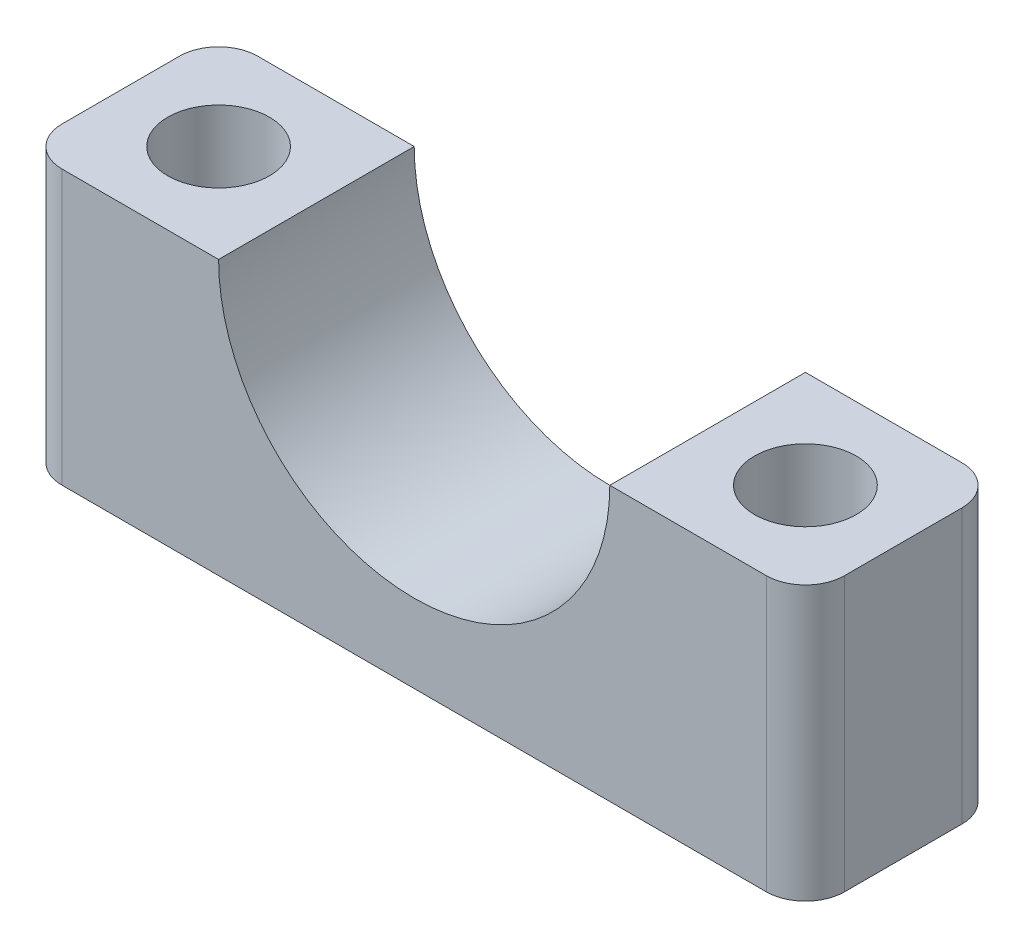
ISO-10303-21;
HEADER;
FILE_DESCRIPTION(('STEP AP214'),'2;1');
FILE_NAME('part.step','',(''),(''),'','','');
FILE_SCHEMA(('AUTOMOTIVE_DESIGN { 1 0 10303 214 1 1 1 1 }'));
ENDSEC;
DATA;
#1=APPLICATION_CONTEXT('core data for automotive mechanical design processes');
#2=APPLICATION_PROTOCOL_DEFINITION('international standard','automotive_design',2000,#1);
#3=PRODUCT_CONTEXT('',#1,'mechanical');
#4=PRODUCT('Part','Part','',(#3));
#5=PRODUCT_RELATED_PRODUCT_CATEGORY('part','',(#4));
#6=PRODUCT_DEFINITION_FORMATION('','',#4);
#7=PRODUCT_DEFINITION_CONTEXT('part definition',#1,'design');
#8=PRODUCT_DEFINITION('design','',#6,#7);
#9=PRODUCT_DEFINITION_SHAPE('','',#8);
#10=(LENGTH_UNIT() NAMED_UNIT(*) SI_UNIT(.MILLI.,.METRE.));
#11=(NAMED_UNIT(*) PLANE_ANGLE_UNIT() SI_UNIT($,.RADIAN.));
#12=(NAMED_UNIT(*) SI_UNIT($,.STERADIAN.) SOLID_ANGLE_UNIT());
#13=UNCERTAINTY_MEASURE_WITH_UNIT(LENGTH_MEASURE(1.E-05),#10,'distance_accuracy_value','');
#14=(GEOMETRIC_REPRESENTATION_CONTEXT(3) GLOBAL_UNCERTAINTY_ASSIGNED_CONTEXT((#13)) GLOBAL_UNIT_ASSIGNED_CONTEXT((#10,
#11,#12)) REPRESENTATION_CONTEXT('',''));
#15=CARTESIAN_POINT('',(0.,0.,0.));
#16=DIRECTION('',(0.,0.,1.));
#17=DIRECTION('',(1.,0.,0.));
#18=AXIS2_PLACEMENT_3D('',#15,#16,#17);
#19=CARTESIAN_POINT('',(0.,0.,10.));
#20=DIRECTION('',(0.,0.,-1.));
#21=DIRECTION('',(-1.,0.,0.));
#22=AXIS2_PLACEMENT_3D('',#19,#20,#21);
#23=CYLINDRICAL_SURFACE('',#22,10.);
#24=CARTESIAN_POINT('',(0.,0.,0.));
#25=DIRECTION('',(0.,0.,-1.));
#26=DIRECTION('',(1.,0.,0.));
#27=AXIS2_PLACEMENT_3D('',#24,#25,#26);
#28=CIRCLE('',#27,10.);
#29=CARTESIAN_POINT('',(10.,0.,0.));
#30=VERTEX_POINT('',#29);
#31=CARTESIAN_POINT('',(-10.,0.,0.));
#32=VERTEX_POINT('',#31);
#33=EDGE_CURVE('E134',#30,#32,#28,.T.);
#34=ORIENTED_EDGE('',*,*,#33,.T.);
#35=DIRECTION('',(0.,0.,-1.));
#36=VECTOR('',#35,1.);
#37=CARTESIAN_POINT('',(-10.,0.,10.));
#38=LINE('',#37,#36);
#39=CARTESIAN_POINT('',(-10.,0.,10.));
#40=VERTEX_POINT('',#39);
#41=EDGE_CURVE('E113',#40,#32,#38,.T.);
#42=ORIENTED_EDGE('',*,*,#41,.F.);
#43=CARTESIAN_POINT('',(0.,0.,10.));
#44=DIRECTION('',(0.,0.,-1.));
#45=DIRECTION('',(1.,0.,0.));
#46=AXIS2_PLACEMENT_3D('',#43,#44,#45);
#47=CIRCLE('',#46,10.);
#48=CARTESIAN_POINT('',(10.,0.,10.));
#49=VERTEX_POINT('',#48);
#50=EDGE_CURVE('E120',#49,#40,#47,.T.);
#51=ORIENTED_EDGE('',*,*,#50,.F.);
#52=DIRECTION('',(0.,0.,-1.));
#53=VECTOR('',#52,1.);
#54=CARTESIAN_POINT('',(10.,0.,10.));
#55=LINE('',#54,#53);
#56=EDGE_CURVE('E185',#49,#30,#55,.T.);
#57=ORIENTED_EDGE('',*,*,#56,.T.);
#58=EDGE_LOOP('',(#34,#42,#51,#57));
#59=FACE_BOUND('',#58,.T.);
#60=ADVANCED_FACE('F33',(#59),#23,.F.);
#61=CARTESIAN_POINT('',(-20.,0.,10.));
#62=DIRECTION('',(0.,-1.,0.));
#63=DIRECTION('',(1.,0.,0.));
#64=AXIS2_PLACEMENT_3D('',#61,#62,#63);
#65=PLANE('',#64);
#66=CARTESIAN_POINT('',(-15.,0.,5.));
#67=DIRECTION('',(0.,1.,0.));
#68=DIRECTION('',(-1.,0.,0.));
#69=AXIS2_PLACEMENT_3D('',#66,#67,#68);
#70=CIRCLE('',#69,2.6);
#71=CARTESIAN_POINT('',(-17.6,0.,5.));
#72=VERTEX_POINT('',#71);
#73=EDGE_CURVE('E196',#72,#72,#70,.T.);
#74=ORIENTED_EDGE('',*,*,#73,.F.);
#75=EDGE_LOOP('',(#74));
#76=FACE_BOUND('',#75,.T.);
#77=DIRECTION('',(-1.,0.,0.));
#78=VECTOR('',#77,1.);
#79=CARTESIAN_POINT('',(-20.,0.,0.));
#80=LINE('',#79,#78);
#81=CARTESIAN_POINT('',(-18.,0.,0.));
#82=VERTEX_POINT('',#81);
#83=EDGE_CURVE('E190',#32,#82,#80,.T.);
#84=ORIENTED_EDGE('',*,*,#83,.T.);
#85=CARTESIAN_POINT('',(-18.,0.,2.));
#86=DIRECTION('',(0.,-1.,0.));
#87=DIRECTION('',(1.,0.,0.));
#88=AXIS2_PLACEMENT_3D('',#85,#86,#87);
#89=CIRCLE('',#88,2.);
#90=CARTESIAN_POINT('',(-20.,0.,2.));
#91=VERTEX_POINT('',#90);
#92=EDGE_CURVE('E11',#82,#91,#89,.F.);
#93=ORIENTED_EDGE('',*,*,#92,.T.);
#94=DIRECTION('',(0.,0.,-1.));
#95=VECTOR('',#94,1.);
#96=CARTESIAN_POINT('',(-20.,0.,10.));
#97=LINE('',#96,#95);
#98=CARTESIAN_POINT('',(-20.,0.,8.));
#99=VERTEX_POINT('',#98);
#100=EDGE_CURVE('E136',#99,#91,#97,.T.);
#101=ORIENTED_EDGE('',*,*,#100,.F.);
#102=CARTESIAN_POINT('',(-18.,0.,8.));
#103=DIRECTION('',(0.,-1.,0.));
#104=DIRECTION('',(1.,0.,0.));
#105=AXIS2_PLACEMENT_3D('',#102,#103,#104);
#106=CIRCLE('',#105,2.);
#107=CARTESIAN_POINT('',(-18.,0.,10.));
#108=VERTEX_POINT('',#107);
#109=EDGE_CURVE('E41',#99,#108,#106,.F.);
#110=ORIENTED_EDGE('',*,*,#109,.T.);
#111=DIRECTION('',(-1.,0.,0.));
#112=VECTOR('',#111,1.);
#113=CARTESIAN_POINT('',(-20.,0.,10.));
#114=LINE('',#113,#112);
#115=EDGE_CURVE('E109',#40,#108,#114,.T.);
#116=ORIENTED_EDGE('',*,*,#115,.F.);
#117=ORIENTED_EDGE('',*,*,#41,.T.);
#118=EDGE_LOOP('',(#84,#93,#101,#110,#116,#117));
#119=FACE_BOUND('',#118,.T.);
#120=ADVANCED_FACE('F111',(#76,#119),#65,.F.);
#121=CARTESIAN_POINT('',(-20.,0.,10.));
#122=DIRECTION('',(1.,0.,0.));
#123=DIRECTION('',(0.,0.,-1.));
#124=AXIS2_PLACEMENT_3D('',#121,#122,#123);
#125=PLANE('',#124);
#126=ORIENTED_EDGE('',*,*,#100,.T.);
#127=DIRECTION('',(0.,-1.,0.));
#128=VECTOR('',#127,1.);
#129=CARTESIAN_POINT('',(-20.,0.,2.));
#130=LINE('',#129,#128);
#131=CARTESIAN_POINT('',(-20.,-14.,2.));
#132=VERTEX_POINT('',#131);
#133=EDGE_CURVE('E167',#91,#132,#130,.T.);
#134=ORIENTED_EDGE('',*,*,#133,.T.);
#135=DIRECTION('',(0.,0.,-1.));
#136=VECTOR('',#135,1.);
#137=CARTESIAN_POINT('',(-20.,-14.,10.));
#138=LINE('',#137,#136);
#139=CARTESIAN_POINT('',(-20.,-14.,8.));
#140=VERTEX_POINT('',#139);
#141=EDGE_CURVE('E140',#140,#132,#138,.T.);
#142=ORIENTED_EDGE('',*,*,#141,.F.);
#143=DIRECTION('',(0.,-1.,0.));
#144=VECTOR('',#143,1.);
#145=CARTESIAN_POINT('',(-20.,0.,8.));
#146=LINE('',#145,#144);
#147=EDGE_CURVE('E53',#140,#99,#146,.F.);
#148=ORIENTED_EDGE('',*,*,#147,.T.);
#149=EDGE_LOOP('',(#126,#134,#142,#148));
#150=FACE_BOUND('',#149,.T.);
#151=ADVANCED_FACE('F171',(#150),#125,.F.);
#152=CARTESIAN_POINT('',(-20.,-14.,10.));
#153=DIRECTION('',(0.,1.,0.));
#154=DIRECTION('',(-1.,0.,0.));
#155=AXIS2_PLACEMENT_3D('',#152,#153,#154);
#156=PLANE('',#155);
#157=CARTESIAN_POINT('',(15.,-14.,4.99999999999999));
#158=DIRECTION('',(0.,1.,0.));
#159=DIRECTION('',(-1.,0.,0.));
#160=AXIS2_PLACEMENT_3D('',#157,#158,#159);
#161=CIRCLE('',#160,2.6);
#162=CARTESIAN_POINT('',(12.4,-14.,4.99999999999999));
#163=VERTEX_POINT('',#162);
#164=EDGE_CURVE('E199',#163,#163,#161,.T.);
#165=ORIENTED_EDGE('',*,*,#164,.T.);
#166=EDGE_LOOP('',(#165));
#167=FACE_BOUND('',#166,.T.);
#168=CARTESIAN_POINT('',(-15.,-14.,5.));
#169=DIRECTION('',(0.,1.,0.));
#170=DIRECTION('',(-1.,0.,0.));
#171=AXIS2_PLACEMENT_3D('',#168,#169,#170);
#172=CIRCLE('',#171,2.6);
#173=CARTESIAN_POINT('',(-17.6,-14.,5.));
#174=VERTEX_POINT('',#173);
#175=EDGE_CURVE('E193',#174,#174,#172,.T.);
#176=ORIENTED_EDGE('',*,*,#175,.T.);
#177=EDGE_LOOP('',(#176));
#178=FACE_BOUND('',#177,.T.);
#179=DIRECTION('',(1.,0.,0.));
#180=VECTOR('',#179,1.);
#181=CARTESIAN_POINT('',(-20.,-14.,0.));
#182=LINE('',#181,#180);
#183=CARTESIAN_POINT('',(-18.,-14.,0.));
#184=VERTEX_POINT('',#183);
#185=CARTESIAN_POINT('',(18.,-14.,0.));
#186=VERTEX_POINT('',#185);
#187=EDGE_CURVE('E188',#184,#186,#182,.T.);
#188=ORIENTED_EDGE('',*,*,#187,.T.);
#189=CARTESIAN_POINT('',(18.,-14.,2.));
#190=DIRECTION('',(0.,1.,0.));
#191=DIRECTION('',(-1.,0.,0.));
#192=AXIS2_PLACEMENT_3D('',#189,#190,#191);
#193=CIRCLE('',#192,2.);
#194=CARTESIAN_POINT('',(20.,-14.,2.));
#195=VERTEX_POINT('',#194);
#196=EDGE_CURVE('E160',#186,#195,#193,.F.);
#197=ORIENTED_EDGE('',*,*,#196,.T.);
#198=DIRECTION('',(0.,0.,-1.));
#199=VECTOR('',#198,1.);
#200=CARTESIAN_POINT('',(20.,-14.,10.));
#201=LINE('',#200,#199);
#202=CARTESIAN_POINT('',(20.,-14.,8.));
#203=VERTEX_POINT('',#202);
#204=EDGE_CURVE('E178',#203,#195,#201,.T.);
#205=ORIENTED_EDGE('',*,*,#204,.F.);
#206=CARTESIAN_POINT('',(18.,-14.,8.));
#207=DIRECTION('',(0.,1.,0.));
#208=DIRECTION('',(-1.,0.,0.));
#209=AXIS2_PLACEMENT_3D('',#206,#207,#208);
#210=CIRCLE('',#209,2.);
#211=CARTESIAN_POINT('',(18.,-14.,10.));
#212=VERTEX_POINT('',#211);
#213=EDGE_CURVE('E158',#203,#212,#210,.F.);
#214=ORIENTED_EDGE('',*,*,#213,.T.);
#215=DIRECTION('',(1.,0.,0.));
#216=VECTOR('',#215,1.);
#217=CARTESIAN_POINT('',(-20.,-14.,10.));
#218=LINE('',#217,#216);
#219=CARTESIAN_POINT('',(-18.,-14.,10.));
#220=VERTEX_POINT('',#219);
#221=EDGE_CURVE('E119',#220,#212,#218,.T.);
#222=ORIENTED_EDGE('',*,*,#221,.F.);
#223=CARTESIAN_POINT('',(-18.,-14.,8.));
#224=DIRECTION('',(0.,1.,0.));
#225=DIRECTION('',(-1.,0.,0.));
#226=AXIS2_PLACEMENT_3D('',#223,#224,#225);
#227=CIRCLE('',#226,2.);
#228=EDGE_CURVE('E154',#220,#140,#227,.F.);
#229=ORIENTED_EDGE('',*,*,#228,.T.);
#230=ORIENTED_EDGE('',*,*,#141,.T.);
#231=CARTESIAN_POINT('',(-18.,-14.,2.));
#232=DIRECTION('',(0.,1.,0.));
#233=DIRECTION('',(-1.,0.,0.));
#234=AXIS2_PLACEMENT_3D('',#231,#232,#233);
#235=CIRCLE('',#234,2.);
#236=EDGE_CURVE('E156',#132,#184,#235,.F.);
#237=ORIENTED_EDGE('',*,*,#236,.T.);
#238=EDGE_LOOP('',(#188,#197,#205,#214,#222,#229,#230,#237));
#239=FACE_BOUND('',#238,.T.);
#240=ADVANCED_FACE('F175',(#167,#178,#239),#156,.F.);
#241=CARTESIAN_POINT('',(20.,0.,10.));
#242=DIRECTION('',(-1.,0.,0.));
#243=DIRECTION('',(0.,-1.,0.));
#244=AXIS2_PLACEMENT_3D('',#241,#242,#243);
#245=PLANE('',#244);
#246=ORIENTED_EDGE('',*,*,#204,.T.);
#247=DIRECTION('',(0.,1.,0.));
#248=VECTOR('',#247,1.);
#249=CARTESIAN_POINT('',(20.,0.,2.));
#250=LINE('',#249,#248);
#251=CARTESIAN_POINT('',(20.,0.,2.));
#252=VERTEX_POINT('',#251);
#253=EDGE_CURVE('E138',#195,#252,#250,.T.);
#254=ORIENTED_EDGE('',*,*,#253,.T.);
#255=DIRECTION('',(0.,0.,-1.));
#256=VECTOR('',#255,1.);
#257=CARTESIAN_POINT('',(20.,0.,10.));
#258=LINE('',#257,#256);
#259=CARTESIAN_POINT('',(20.,0.,8.));
#260=VERTEX_POINT('',#259);
#261=EDGE_CURVE('E180',#260,#252,#258,.T.);
#262=ORIENTED_EDGE('',*,*,#261,.F.);
#263=DIRECTION('',(0.,1.,0.));
#264=VECTOR('',#263,1.);
#265=CARTESIAN_POINT('',(20.,-14.,8.));
#266=LINE('',#265,#264);
#267=EDGE_CURVE('E135',#260,#203,#266,.F.);
#268=ORIENTED_EDGE('',*,*,#267,.T.);
#269=EDGE_LOOP('',(#246,#254,#262,#268));
#270=FACE_BOUND('',#269,.T.);
#271=ADVANCED_FACE('F220',(#270),#245,.F.);
#272=CARTESIAN_POINT('',(10.,0.,10.));
#273=DIRECTION('',(0.,-1.,0.));
#274=DIRECTION('',(1.,0.,0.));
#275=AXIS2_PLACEMENT_3D('',#272,#273,#274);
#276=PLANE('',#275);
#277=CARTESIAN_POINT('',(15.,0.,4.99999999999999));
#278=DIRECTION('',(0.,1.,0.));
#279=DIRECTION('',(-1.,0.,0.));
#280=AXIS2_PLACEMENT_3D('',#277,#278,#279);
#281=CIRCLE('',#280,2.6);
#282=CARTESIAN_POINT('',(12.4,0.,4.99999999999999));
#283=VERTEX_POINT('',#282);
#284=EDGE_CURVE('E202',#283,#283,#281,.T.);
#285=ORIENTED_EDGE('',*,*,#284,.F.);
#286=EDGE_LOOP('',(#285));
#287=FACE_BOUND('',#286,.T.);
#288=ORIENTED_EDGE('',*,*,#261,.T.);
#289=CARTESIAN_POINT('',(18.,0.,2.));
#290=DIRECTION('',(0.,-1.,0.));
#291=DIRECTION('',(1.,0.,0.));
#292=AXIS2_PLACEMENT_3D('',#289,#290,#291);
#293=CIRCLE('',#292,2.);
#294=CARTESIAN_POINT('',(18.,0.,0.));
#295=VERTEX_POINT('',#294);
#296=EDGE_CURVE('E148',#252,#295,#293,.F.);
#297=ORIENTED_EDGE('',*,*,#296,.T.);
#298=DIRECTION('',(-1.,0.,0.));
#299=VECTOR('',#298,1.);
#300=CARTESIAN_POINT('',(10.,0.,0.));
#301=LINE('',#300,#299);
#302=EDGE_CURVE('E131',#295,#30,#301,.T.);
#303=ORIENTED_EDGE('',*,*,#302,.T.);
#304=ORIENTED_EDGE('',*,*,#56,.F.);
#305=DIRECTION('',(-1.,0.,0.));
#306=VECTOR('',#305,1.);
#307=CARTESIAN_POINT('',(10.,0.,10.));
#308=LINE('',#307,#306);
#309=CARTESIAN_POINT('',(18.,0.,10.));
#310=VERTEX_POINT('',#309);
#311=EDGE_CURVE('E127',#310,#49,#308,.T.);
#312=ORIENTED_EDGE('',*,*,#311,.F.);
#313=CARTESIAN_POINT('',(18.,0.,8.));
#314=DIRECTION('',(0.,-1.,0.));
#315=DIRECTION('',(1.,0.,0.));
#316=AXIS2_PLACEMENT_3D('',#313,#314,#315);
#317=CIRCLE('',#316,2.);
#318=EDGE_CURVE('E146',#310,#260,#317,.F.);
#319=ORIENTED_EDGE('',*,*,#318,.T.);
#320=EDGE_LOOP('',(#288,#297,#303,#304,#312,#319));
#321=FACE_BOUND('',#320,.T.);
#322=ADVANCED_FACE('F217',(#287,#321),#276,.F.);
#323=CARTESIAN_POINT('',(0.,0.,10.));
#324=DIRECTION('',(0.,0.,1.));
#325=DIRECTION('',(1.,0.,0.));
#326=AXIS2_PLACEMENT_3D('',#323,#324,#325);
#327=PLANE('',#326);
#328=ORIENTED_EDGE('',*,*,#221,.T.);
#329=DIRECTION('',(0.,1.,0.));
#330=VECTOR('',#329,1.);
#331=CARTESIAN_POINT('',(18.,0.,10.));
#332=LINE('',#331,#330);
#333=EDGE_CURVE('E164',#212,#310,#332,.T.);
#334=ORIENTED_EDGE('',*,*,#333,.T.);
#335=ORIENTED_EDGE('',*,*,#311,.T.);
#336=ORIENTED_EDGE('',*,*,#50,.T.);
#337=ORIENTED_EDGE('',*,*,#115,.T.);
#338=DIRECTION('',(0.,-1.,0.));
#339=VECTOR('',#338,1.);
#340=CARTESIAN_POINT('',(-18.,-14.,10.));
#341=LINE('',#340,#339);
#342=EDGE_CURVE('E162',#108,#220,#341,.T.);
#343=ORIENTED_EDGE('',*,*,#342,.T.);
#344=EDGE_LOOP('',(#328,#334,#335,#336,#337,#343));
#345=FACE_BOUND('',#344,.T.);
#346=ADVANCED_FACE('F124',(#345),#327,.T.);
#347=CARTESIAN_POINT('',(0.,0.,0.));
#348=DIRECTION('',(0.,0.,1.));
#349=DIRECTION('',(1.,0.,0.));
#350=AXIS2_PLACEMENT_3D('',#347,#348,#349);
#351=PLANE('',#350);
#352=ORIENTED_EDGE('',*,*,#302,.F.);
#353=DIRECTION('',(0.,1.,0.));
#354=VECTOR('',#353,1.);
#355=CARTESIAN_POINT('',(18.,0.,0.));
#356=LINE('',#355,#354);
#357=EDGE_CURVE('E152',#295,#186,#356,.F.);
#358=ORIENTED_EDGE('',*,*,#357,.T.);
#359=ORIENTED_EDGE('',*,*,#187,.F.);
#360=DIRECTION('',(0.,-1.,0.));
#361=VECTOR('',#360,1.);
#362=CARTESIAN_POINT('',(-18.,0.,0.));
#363=LINE('',#362,#361);
#364=EDGE_CURVE('E150',#184,#82,#363,.F.);
#365=ORIENTED_EDGE('',*,*,#364,.T.);
#366=ORIENTED_EDGE('',*,*,#83,.F.);
#367=ORIENTED_EDGE('',*,*,#33,.F.);
#368=EDGE_LOOP('',(#352,#358,#359,#365,#366,#367));
#369=FACE_BOUND('',#368,.T.);
#370=ADVANCED_FACE('F253',(#369),#351,.F.);
#371=CARTESIAN_POINT('',(18.,0.,2.));
#372=DIRECTION('',(0.,1.,0.));
#373=DIRECTION('',(-1.,0.,0.));
#374=AXIS2_PLACEMENT_3D('',#371,#372,#373);
#375=CYLINDRICAL_SURFACE('',#374,2.);
#376=ORIENTED_EDGE('',*,*,#196,.F.);
#377=ORIENTED_EDGE('',*,*,#357,.F.);
#378=ORIENTED_EDGE('',*,*,#296,.F.);
#379=ORIENTED_EDGE('',*,*,#253,.F.);
#380=EDGE_LOOP('',(#376,#377,#378,#379));
#381=FACE_BOUND('',#380,.T.);
#382=ADVANCED_FACE('F250',(#381),#375,.T.);
#383=CARTESIAN_POINT('',(18.,0.,8.));
#384=DIRECTION('',(0.,-1.,0.));
#385=DIRECTION('',(1.,0.,0.));
#386=AXIS2_PLACEMENT_3D('',#383,#384,#385);
#387=CYLINDRICAL_SURFACE('',#386,2.);
#388=ORIENTED_EDGE('',*,*,#213,.F.);
#389=ORIENTED_EDGE('',*,*,#267,.F.);
#390=ORIENTED_EDGE('',*,*,#318,.F.);
#391=ORIENTED_EDGE('',*,*,#333,.F.);
#392=EDGE_LOOP('',(#388,#389,#390,#391));
#393=FACE_BOUND('',#392,.T.);
#394=ADVANCED_FACE('F230',(#393),#387,.T.);
#395=CARTESIAN_POINT('',(-18.,0.,2.));
#396=DIRECTION('',(0.,-1.,0.));
#397=DIRECTION('',(0.,0.,-1.));
#398=AXIS2_PLACEMENT_3D('',#395,#396,#397);
#399=CYLINDRICAL_SURFACE('',#398,2.);
#400=ORIENTED_EDGE('',*,*,#92,.F.);
#401=ORIENTED_EDGE('',*,*,#364,.F.);
#402=ORIENTED_EDGE('',*,*,#236,.F.);
#403=ORIENTED_EDGE('',*,*,#133,.F.);
#404=EDGE_LOOP('',(#400,#401,#402,#403));
#405=FACE_BOUND('',#404,.T.);
#406=ADVANCED_FACE('F234',(#405),#399,.T.);
#407=CARTESIAN_POINT('',(-18.,0.,8.));
#408=DIRECTION('',(0.,1.,0.));
#409=DIRECTION('',(0.,0.,1.));
#410=AXIS2_PLACEMENT_3D('',#407,#408,#409);
#411=CYLINDRICAL_SURFACE('',#410,2.);
#412=ORIENTED_EDGE('',*,*,#109,.F.);
#413=ORIENTED_EDGE('',*,*,#147,.F.);
#414=ORIENTED_EDGE('',*,*,#228,.F.);
#415=ORIENTED_EDGE('',*,*,#342,.F.);
#416=EDGE_LOOP('',(#412,#413,#414,#415));
#417=FACE_BOUND('',#416,.T.);
#418=ADVANCED_FACE('F35',(#417),#411,.T.);
#419=CARTESIAN_POINT('',(-15.,-14.,5.));
#420=DIRECTION('',(0.,1.,0.));
#421=DIRECTION('',(-1.,0.,0.));
#422=AXIS2_PLACEMENT_3D('',#419,#420,#421);
#423=CYLINDRICAL_SURFACE('',#422,2.6);
#424=ORIENTED_EDGE('',*,*,#175,.F.);
#425=EDGE_LOOP('',(#424));
#426=FACE_BOUND('',#425,.T.);
#427=ORIENTED_EDGE('',*,*,#73,.T.);
#428=EDGE_LOOP('',(#427));
#429=FACE_BOUND('',#428,.T.);
#430=ADVANCED_FACE('F213',(#426,#429),#423,.F.);
#431=CARTESIAN_POINT('',(15.,-14.,4.99999999999999));
#432=DIRECTION('',(0.,1.,0.));
#433=DIRECTION('',(-1.,0.,0.));
#434=AXIS2_PLACEMENT_3D('',#431,#432,#433);
#435=CYLINDRICAL_SURFACE('',#434,2.6);
#436=ORIENTED_EDGE('',*,*,#164,.F.);
#437=EDGE_LOOP('',(#436));
#438=FACE_BOUND('',#437,.T.);
#439=ORIENTED_EDGE('',*,*,#284,.T.);
#440=EDGE_LOOP('',(#439));
#441=FACE_BOUND('',#440,.T.);
#442=ADVANCED_FACE('F210',(#438,#441),#435,.F.);
#443=CLOSED_SHELL('',(#60,#120,#151,#240,#271,#322,#346,#370,#382,#394,#406,#418,#430,#442));
#444=MANIFOLD_SOLID_BREP('B2',#443);
#445=ADVANCED_BREP_SHAPE_REPRESENTATION('',(#18,#444),#14);
#446=SHAPE_DEFINITION_REPRESENTATION(#9,#445);
ENDSEC;
END-ISO-10303-21;
